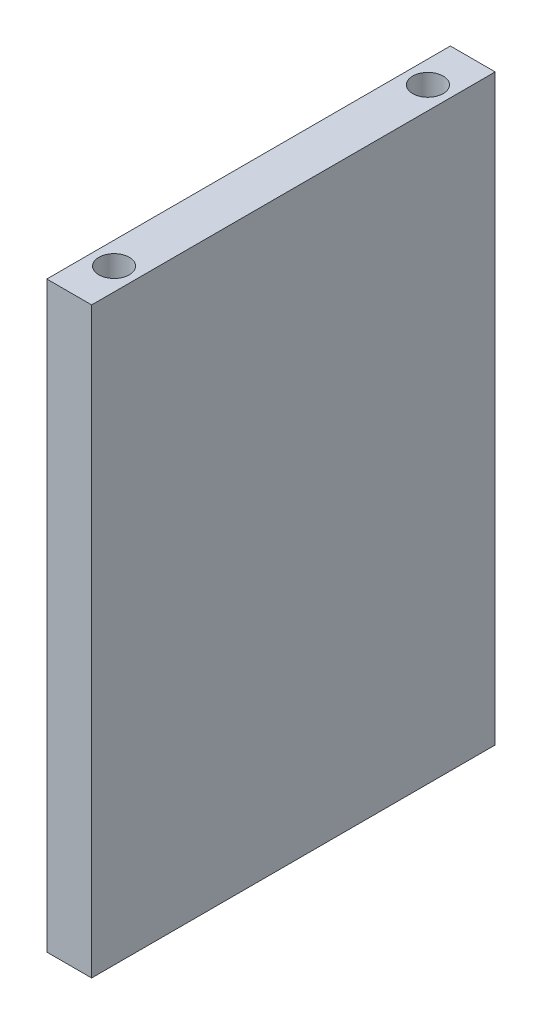
ISO-10303-21;
HEADER;
FILE_DESCRIPTION(('STEP AP214'),'2;1');
FILE_NAME('part.step','',(''),(''),'','','');
FILE_SCHEMA(('AUTOMOTIVE_DESIGN { 1 0 10303 214 1 1 1 1 }'));
ENDSEC;
DATA;
#1=APPLICATION_CONTEXT('core data for automotive mechanical design processes');
#2=APPLICATION_PROTOCOL_DEFINITION('international standard','automotive_design',2000,#1);
#3=PRODUCT_CONTEXT('',#1,'mechanical');
#4=PRODUCT('Part','Part','',(#3));
#5=PRODUCT_RELATED_PRODUCT_CATEGORY('part','',(#4));
#6=PRODUCT_DEFINITION_FORMATION('','',#4);
#7=PRODUCT_DEFINITION_CONTEXT('part definition',#1,'design');
#8=PRODUCT_DEFINITION('design','',#6,#7);
#9=PRODUCT_DEFINITION_SHAPE('','',#8);
#10=(LENGTH_UNIT() NAMED_UNIT(*) SI_UNIT(.MILLI.,.METRE.));
#11=(NAMED_UNIT(*) PLANE_ANGLE_UNIT() SI_UNIT($,.RADIAN.));
#12=(NAMED_UNIT(*) SI_UNIT($,.STERADIAN.) SOLID_ANGLE_UNIT());
#13=UNCERTAINTY_MEASURE_WITH_UNIT(LENGTH_MEASURE(1.E-05),#10,'distance_accuracy_value','');
#14=(GEOMETRIC_REPRESENTATION_CONTEXT(3) GLOBAL_UNCERTAINTY_ASSIGNED_CONTEXT((#13)) GLOBAL_UNIT_ASSIGNED_CONTEXT((#10,
#11,#12)) REPRESENTATION_CONTEXT('',''));
#15=CARTESIAN_POINT('',(0.,0.,0.));
#16=DIRECTION('',(0.,0.,1.));
#17=DIRECTION('',(1.,0.,0.));
#18=AXIS2_PLACEMENT_3D('',#15,#16,#17);
#19=CARTESIAN_POINT('',(0.,65.,0.));
#20=DIRECTION('',(1.,0.,0.));
#21=DIRECTION('',(0.,0.,-1.));
#22=AXIS2_PLACEMENT_3D('',#19,#20,#21);
#23=PLANE('',#22);
#24=DIRECTION('',(0.,0.,1.));
#25=VECTOR('',#24,1.);
#26=CARTESIAN_POINT('',(0.,0.,0.));
#27=LINE('',#26,#25);
#28=CARTESIAN_POINT('',(0.,0.,-45.));
#29=VERTEX_POINT('',#28);
#30=CARTESIAN_POINT('',(0.,0.,0.));
#31=VERTEX_POINT('',#30);
#32=EDGE_CURVE('E126',#29,#31,#27,.T.);
#33=ORIENTED_EDGE('',*,*,#32,.T.);
#34=DIRECTION('',(0.,-1.,0.));
#35=VECTOR('',#34,1.);
#36=CARTESIAN_POINT('',(0.,65.,0.));
#37=LINE('',#36,#35);
#38=CARTESIAN_POINT('',(0.,65.,0.));
#39=VERTEX_POINT('',#38);
#40=EDGE_CURVE('E11',#39,#31,#37,.T.);
#41=ORIENTED_EDGE('',*,*,#40,.F.);
#42=DIRECTION('',(0.,0.,1.));
#43=VECTOR('',#42,1.);
#44=CARTESIAN_POINT('',(0.,65.,0.));
#45=LINE('',#44,#43);
#46=CARTESIAN_POINT('',(0.,65.,-45.));
#47=VERTEX_POINT('',#46);
#48=EDGE_CURVE('E127',#47,#39,#45,.T.);
#49=ORIENTED_EDGE('',*,*,#48,.F.);
#50=DIRECTION('',(0.,-1.,0.));
#51=VECTOR('',#50,1.);
#52=CARTESIAN_POINT('',(0.,65.,-45.));
#53=LINE('',#52,#51);
#54=EDGE_CURVE('E133',#47,#29,#53,.T.);
#55=ORIENTED_EDGE('',*,*,#54,.T.);
#56=EDGE_LOOP('',(#33,#41,#49,#55));
#57=FACE_BOUND('',#56,.T.);
#58=ADVANCED_FACE('F33',(#57),#23,.F.);
#59=CARTESIAN_POINT('',(0.,65.,0.));
#60=DIRECTION('',(0.,0.,-1.));
#61=DIRECTION('',(-1.,0.,0.));
#62=AXIS2_PLACEMENT_3D('',#59,#60,#61);
#63=PLANE('',#62);
#64=DIRECTION('',(1.,0.,0.));
#65=VECTOR('',#64,1.);
#66=CARTESIAN_POINT('',(0.,0.,0.));
#67=LINE('',#66,#65);
#68=CARTESIAN_POINT('',(5.,0.,0.));
#69=VERTEX_POINT('',#68);
#70=EDGE_CURVE('E136',#31,#69,#67,.T.);
#71=ORIENTED_EDGE('',*,*,#70,.T.);
#72=DIRECTION('',(0.,-1.,0.));
#73=VECTOR('',#72,1.);
#74=CARTESIAN_POINT('',(5.,65.,0.));
#75=LINE('',#74,#73);
#76=CARTESIAN_POINT('',(5.,65.,0.));
#77=VERTEX_POINT('',#76);
#78=EDGE_CURVE('E41',#77,#69,#75,.T.);
#79=ORIENTED_EDGE('',*,*,#78,.F.);
#80=DIRECTION('',(1.,0.,0.));
#81=VECTOR('',#80,1.);
#82=CARTESIAN_POINT('',(0.,65.,0.));
#83=LINE('',#82,#81);
#84=EDGE_CURVE('E80',#39,#77,#83,.T.);
#85=ORIENTED_EDGE('',*,*,#84,.F.);
#86=ORIENTED_EDGE('',*,*,#40,.T.);
#87=EDGE_LOOP('',(#71,#79,#85,#86));
#88=FACE_BOUND('',#87,.T.);
#89=ADVANCED_FACE('F160',(#88),#63,.F.);
#90=CARTESIAN_POINT('',(5.,65.,0.));
#91=DIRECTION('',(-1.,0.,0.));
#92=DIRECTION('',(0.,0.,1.));
#93=AXIS2_PLACEMENT_3D('',#90,#91,#92);
#94=PLANE('',#93);
#95=DIRECTION('',(0.,0.,-1.));
#96=VECTOR('',#95,1.);
#97=CARTESIAN_POINT('',(5.,0.,0.));
#98=LINE('',#97,#96);
#99=CARTESIAN_POINT('',(5.,0.,-45.));
#100=VERTEX_POINT('',#99);
#101=EDGE_CURVE('E67',#69,#100,#98,.T.);
#102=ORIENTED_EDGE('',*,*,#101,.T.);
#103=DIRECTION('',(0.,-1.,0.));
#104=VECTOR('',#103,1.);
#105=CARTESIAN_POINT('',(5.,65.,-45.));
#106=LINE('',#105,#104);
#107=CARTESIAN_POINT('',(5.,65.,-45.));
#108=VERTEX_POINT('',#107);
#109=EDGE_CURVE('E141',#108,#100,#106,.T.);
#110=ORIENTED_EDGE('',*,*,#109,.F.);
#111=DIRECTION('',(0.,0.,-1.));
#112=VECTOR('',#111,1.);
#113=CARTESIAN_POINT('',(5.,65.,0.));
#114=LINE('',#113,#112);
#115=EDGE_CURVE('E130',#77,#108,#114,.T.);
#116=ORIENTED_EDGE('',*,*,#115,.F.);
#117=ORIENTED_EDGE('',*,*,#78,.T.);
#118=EDGE_LOOP('',(#102,#110,#116,#117));
#119=FACE_BOUND('',#118,.T.);
#120=ADVANCED_FACE('F143',(#119),#94,.F.);
#121=CARTESIAN_POINT('',(0.,65.,-45.));
#122=DIRECTION('',(0.,0.,1.));
#123=DIRECTION('',(1.,0.,0.));
#124=AXIS2_PLACEMENT_3D('',#121,#122,#123);
#125=PLANE('',#124);
#126=DIRECTION('',(-1.,0.,0.));
#127=VECTOR('',#126,1.);
#128=CARTESIAN_POINT('',(0.,0.,-45.));
#129=LINE('',#128,#127);
#130=EDGE_CURVE('E73',#100,#29,#129,.T.);
#131=ORIENTED_EDGE('',*,*,#130,.T.);
#132=ORIENTED_EDGE('',*,*,#54,.F.);
#133=DIRECTION('',(-1.,0.,0.));
#134=VECTOR('',#133,1.);
#135=CARTESIAN_POINT('',(0.,65.,-45.));
#136=LINE('',#135,#134);
#137=EDGE_CURVE('E49',#108,#47,#136,.T.);
#138=ORIENTED_EDGE('',*,*,#137,.F.);
#139=ORIENTED_EDGE('',*,*,#109,.T.);
#140=EDGE_LOOP('',(#131,#132,#138,#139));
#141=FACE_BOUND('',#140,.T.);
#142=ADVANCED_FACE('F150',(#141),#125,.F.);
#143=CARTESIAN_POINT('',(0.,65.,0.));
#144=DIRECTION('',(0.,-1.,0.));
#145=DIRECTION('',(0.,0.,-1.));
#146=AXIS2_PLACEMENT_3D('',#143,#144,#145);
#147=PLANE('',#146);
#148=CARTESIAN_POINT('',(2.5,65.,-40.));
#149=DIRECTION('',(0.,1.,0.));
#150=DIRECTION('',(0.,0.,1.));
#151=AXIS2_PLACEMENT_3D('',#148,#149,#150);
#152=CIRCLE('',#151,1.69999999999999);
#153=CARTESIAN_POINT('',(2.5,65.,-38.3));
#154=VERTEX_POINT('',#153);
#155=EDGE_CURVE('E114',#154,#154,#152,.T.);
#156=ORIENTED_EDGE('',*,*,#155,.F.);
#157=EDGE_LOOP('',(#156));
#158=FACE_BOUND('',#157,.T.);
#159=CARTESIAN_POINT('',(2.5,65.,-5.));
#160=DIRECTION('',(0.,1.,0.));
#161=DIRECTION('',(0.,0.,1.));
#162=AXIS2_PLACEMENT_3D('',#159,#160,#161);
#163=CIRCLE('',#162,1.69999999999999);
#164=CARTESIAN_POINT('',(2.5,65.,-3.30000000000001));
#165=VERTEX_POINT('',#164);
#166=EDGE_CURVE('E120',#165,#165,#163,.T.);
#167=ORIENTED_EDGE('',*,*,#166,.F.);
#168=EDGE_LOOP('',(#167));
#169=FACE_BOUND('',#168,.T.);
#170=ORIENTED_EDGE('',*,*,#48,.T.);
#171=ORIENTED_EDGE('',*,*,#84,.T.);
#172=ORIENTED_EDGE('',*,*,#115,.T.);
#173=ORIENTED_EDGE('',*,*,#137,.T.);
#174=EDGE_LOOP('',(#170,#171,#172,#173));
#175=FACE_BOUND('',#174,.T.);
#176=ADVANCED_FACE('F152',(#158,#169,#175),#147,.F.);
#177=CARTESIAN_POINT('',(0.,0.,0.));
#178=DIRECTION('',(0.,-1.,0.));
#179=DIRECTION('',(0.,0.,-1.));
#180=AXIS2_PLACEMENT_3D('',#177,#178,#179);
#181=PLANE('',#180);
#182=CARTESIAN_POINT('',(2.5,0.,-39.9996550372803));
#183=DIRECTION('',(0.,-1.,0.));
#184=DIRECTION('',(0.,0.,-1.));
#185=AXIS2_PLACEMENT_3D('',#182,#183,#184);
#186=CIRCLE('',#185,1.69999999999999);
#187=CARTESIAN_POINT('',(2.5,0.,-41.6996550372803));
#188=VERTEX_POINT('',#187);
#189=EDGE_CURVE('E104',#188,#188,#186,.T.);
#190=ORIENTED_EDGE('',*,*,#189,.F.);
#191=EDGE_LOOP('',(#190));
#192=FACE_BOUND('',#191,.T.);
#193=CARTESIAN_POINT('',(2.5,0.,-4.99965503728025));
#194=DIRECTION('',(0.,-1.,0.));
#195=DIRECTION('',(0.,0.,-1.));
#196=AXIS2_PLACEMENT_3D('',#193,#194,#195);
#197=CIRCLE('',#196,1.69999999999999);
#198=CARTESIAN_POINT('',(2.5,0.,-6.69965503728024));
#199=VERTEX_POINT('',#198);
#200=EDGE_CURVE('E103',#199,#199,#197,.T.);
#201=ORIENTED_EDGE('',*,*,#200,.F.);
#202=EDGE_LOOP('',(#201));
#203=FACE_BOUND('',#202,.T.);
#204=ORIENTED_EDGE('',*,*,#32,.F.);
#205=ORIENTED_EDGE('',*,*,#130,.F.);
#206=ORIENTED_EDGE('',*,*,#101,.F.);
#207=ORIENTED_EDGE('',*,*,#70,.F.);
#208=EDGE_LOOP('',(#204,#205,#206,#207));
#209=FACE_BOUND('',#208,.T.);
#210=ADVANCED_FACE('F146',(#192,#203,#209),#181,.T.);
#211=CARTESIAN_POINT('',(2.5,58.,-5.));
#212=DIRECTION('',(0.,1.,0.));
#213=DIRECTION('',(0.,0.,1.));
#214=AXIS2_PLACEMENT_3D('',#211,#212,#213);
#215=CONICAL_SURFACE('',#214,1.69999999999999,1.02974425867665);
#216=CARTESIAN_POINT('',(2.5,56.9785369476532,-5.));
#217=VERTEX_POINT('',#216);
#218=VERTEX_LOOP('',#217);
#219=FACE_BOUND('',#218,.T.);
#220=CARTESIAN_POINT('',(2.5,58.,-5.));
#221=DIRECTION('',(0.,1.,0.));
#222=DIRECTION('',(0.,0.,1.));
#223=AXIS2_PLACEMENT_3D('',#220,#221,#222);
#224=CIRCLE('',#223,1.69999999999999);
#225=CARTESIAN_POINT('',(2.5,58.,-3.30000000000001));
#226=VERTEX_POINT('',#225);
#227=EDGE_CURVE('E123',#226,#226,#224,.T.);
#228=ORIENTED_EDGE('',*,*,#227,.T.);
#229=EDGE_LOOP('',(#228));
#230=FACE_BOUND('',#229,.T.);
#231=ADVANCED_FACE('F190',(#219,#230),#215,.F.);
#232=CARTESIAN_POINT('',(2.5,65.,-5.));
#233=DIRECTION('',(0.,1.,0.));
#234=DIRECTION('',(0.,0.,1.));
#235=AXIS2_PLACEMENT_3D('',#232,#233,#234);
#236=CYLINDRICAL_SURFACE('',#235,1.69999999999999);
#237=ORIENTED_EDGE('',*,*,#227,.F.);
#238=EDGE_LOOP('',(#237));
#239=FACE_BOUND('',#238,.T.);
#240=ORIENTED_EDGE('',*,*,#166,.T.);
#241=EDGE_LOOP('',(#240));
#242=FACE_BOUND('',#241,.T.);
#243=ADVANCED_FACE('F195',(#239,#242),#236,.F.);
#244=CARTESIAN_POINT('',(2.5,58.,-40.));
#245=DIRECTION('',(0.,1.,0.));
#246=DIRECTION('',(0.,0.,1.));
#247=AXIS2_PLACEMENT_3D('',#244,#245,#246);
#248=CONICAL_SURFACE('',#247,1.69999999999999,1.02974425867665);
#249=CARTESIAN_POINT('',(2.5,56.9785369476532,-40.));
#250=VERTEX_POINT('',#249);
#251=VERTEX_LOOP('',#250);
#252=FACE_BOUND('',#251,.T.);
#253=CARTESIAN_POINT('',(2.5,58.,-40.));
#254=DIRECTION('',(0.,1.,0.));
#255=DIRECTION('',(0.,0.,1.));
#256=AXIS2_PLACEMENT_3D('',#253,#254,#255);
#257=CIRCLE('',#256,1.69999999999999);
#258=CARTESIAN_POINT('',(2.5,58.,-38.3));
#259=VERTEX_POINT('',#258);
#260=EDGE_CURVE('E117',#259,#259,#257,.T.);
#261=ORIENTED_EDGE('',*,*,#260,.T.);
#262=EDGE_LOOP('',(#261));
#263=FACE_BOUND('',#262,.T.);
#264=ADVANCED_FACE('F205',(#252,#263),#248,.F.);
#265=CARTESIAN_POINT('',(2.5,65.,-40.));
#266=DIRECTION('',(0.,1.,0.));
#267=DIRECTION('',(0.,0.,1.));
#268=AXIS2_PLACEMENT_3D('',#265,#266,#267);
#269=CYLINDRICAL_SURFACE('',#268,1.69999999999999);
#270=ORIENTED_EDGE('',*,*,#260,.F.);
#271=EDGE_LOOP('',(#270));
#272=FACE_BOUND('',#271,.T.);
#273=ORIENTED_EDGE('',*,*,#155,.T.);
#274=EDGE_LOOP('',(#273));
#275=FACE_BOUND('',#274,.T.);
#276=ADVANCED_FACE('F215',(#272,#275),#269,.F.);
#277=CARTESIAN_POINT('',(2.5,6.99999999999999,-4.99965503728025));
#278=DIRECTION('',(0.,-1.,0.));
#279=DIRECTION('',(0.,0.,-1.));
#280=AXIS2_PLACEMENT_3D('',#277,#278,#279);
#281=CONICAL_SURFACE('',#280,1.69999999999999,1.02974425867665);
#282=CARTESIAN_POINT('',(2.5,8.02146305234684,-4.99965503728025));
#283=VERTEX_POINT('',#282);
#284=VERTEX_LOOP('',#283);
#285=FACE_BOUND('',#284,.T.);
#286=CARTESIAN_POINT('',(2.5,6.99999999999999,-4.99965503728025));
#287=DIRECTION('',(0.,-1.,0.));
#288=DIRECTION('',(0.,0.,-1.));
#289=AXIS2_PLACEMENT_3D('',#286,#287,#288);
#290=CIRCLE('',#289,1.69999999999999);
#291=CARTESIAN_POINT('',(2.5,6.99999999999999,-6.69965503728024));
#292=VERTEX_POINT('',#291);
#293=EDGE_CURVE('E107',#292,#292,#290,.T.);
#294=ORIENTED_EDGE('',*,*,#293,.T.);
#295=EDGE_LOOP('',(#294));
#296=FACE_BOUND('',#295,.T.);
#297=ADVANCED_FACE('F225',(#285,#296),#281,.F.);
#298=CARTESIAN_POINT('',(2.5,0.,-4.99965503728025));
#299=DIRECTION('',(0.,-1.,0.));
#300=DIRECTION('',(0.,0.,-1.));
#301=AXIS2_PLACEMENT_3D('',#298,#299,#300);
#302=CYLINDRICAL_SURFACE('',#301,1.69999999999999);
#303=ORIENTED_EDGE('',*,*,#293,.F.);
#304=EDGE_LOOP('',(#303));
#305=FACE_BOUND('',#304,.T.);
#306=ORIENTED_EDGE('',*,*,#200,.T.);
#307=EDGE_LOOP('',(#306));
#308=FACE_BOUND('',#307,.T.);
#309=ADVANCED_FACE('F97',(#305,#308),#302,.F.);
#310=CARTESIAN_POINT('',(2.5,6.99999999999999,-39.9996550372803));
#311=DIRECTION('',(0.,-1.,0.));
#312=DIRECTION('',(0.,0.,-1.));
#313=AXIS2_PLACEMENT_3D('',#310,#311,#312);
#314=CONICAL_SURFACE('',#313,1.69999999999999,1.02974425867665);
#315=CARTESIAN_POINT('',(2.5,8.02146305234684,-39.9996550372803));
#316=VERTEX_POINT('',#315);
#317=VERTEX_LOOP('',#316);
#318=FACE_BOUND('',#317,.T.);
#319=CARTESIAN_POINT('',(2.5,6.99999999999999,-39.9996550372803));
#320=DIRECTION('',(0.,-1.,0.));
#321=DIRECTION('',(0.,0.,-1.));
#322=AXIS2_PLACEMENT_3D('',#319,#320,#321);
#323=CIRCLE('',#322,1.69999999999999);
#324=CARTESIAN_POINT('',(2.5,6.99999999999999,-41.6996550372802));
#325=VERTEX_POINT('',#324);
#326=EDGE_CURVE('E101',#325,#325,#323,.T.);
#327=ORIENTED_EDGE('',*,*,#326,.T.);
#328=EDGE_LOOP('',(#327));
#329=FACE_BOUND('',#328,.T.);
#330=ADVANCED_FACE('F93',(#318,#329),#314,.F.);
#331=CARTESIAN_POINT('',(2.5,0.,-39.9996550372803));
#332=DIRECTION('',(0.,-1.,0.));
#333=DIRECTION('',(0.,0.,-1.));
#334=AXIS2_PLACEMENT_3D('',#331,#332,#333);
#335=CYLINDRICAL_SURFACE('',#334,1.69999999999999);
#336=ORIENTED_EDGE('',*,*,#326,.F.);
#337=EDGE_LOOP('',(#336));
#338=FACE_BOUND('',#337,.T.);
#339=ORIENTED_EDGE('',*,*,#189,.T.);
#340=EDGE_LOOP('',(#339));
#341=FACE_BOUND('',#340,.T.);
#342=ADVANCED_FACE('F96',(#338,#341),#335,.F.);
#343=CLOSED_SHELL('',(#58,#89,#120,#142,#176,#210,#231,#243,#264,#276,#297,#309,#330,#342));
#344=MANIFOLD_SOLID_BREP('B2',#343);
#345=ADVANCED_BREP_SHAPE_REPRESENTATION('',(#18,#344),#14);
#346=SHAPE_DEFINITION_REPRESENTATION(#9,#345);
ENDSEC;
END-ISO-10303-21;
